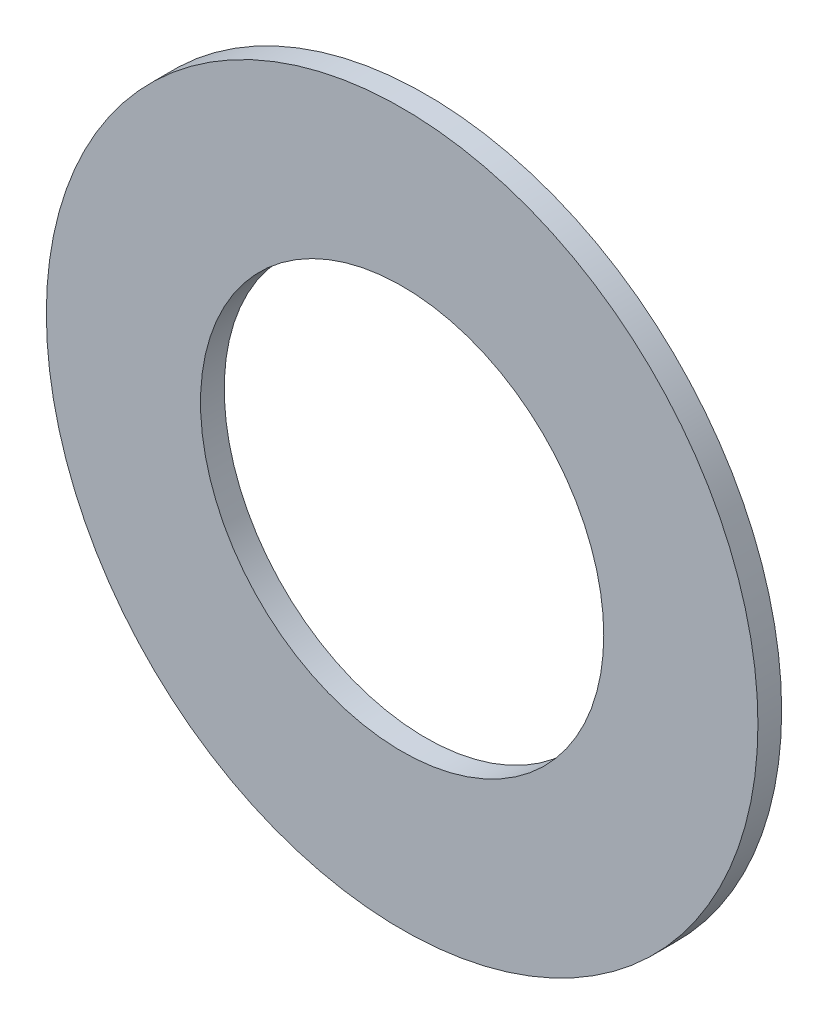
ISO-10303-21;
HEADER;
FILE_DESCRIPTION(('STEP AP214'),'2;1');
FILE_NAME('part.step','',(''),(''),'','','');
FILE_SCHEMA(('AUTOMOTIVE_DESIGN { 1 0 10303 214 1 1 1 1 }'));
ENDSEC;
DATA;
#1=APPLICATION_CONTEXT('core data for automotive mechanical design processes');
#2=APPLICATION_PROTOCOL_DEFINITION('international standard','automotive_design',2000,#1);
#3=PRODUCT_CONTEXT('',#1,'mechanical');
#4=PRODUCT('Part','Part','',(#3));
#5=PRODUCT_RELATED_PRODUCT_CATEGORY('part','',(#4));
#6=PRODUCT_DEFINITION_FORMATION('','',#4);
#7=PRODUCT_DEFINITION_CONTEXT('part definition',#1,'design');
#8=PRODUCT_DEFINITION('design','',#6,#7);
#9=PRODUCT_DEFINITION_SHAPE('','',#8);
#10=(LENGTH_UNIT() NAMED_UNIT(*) SI_UNIT(.MILLI.,.METRE.));
#11=(NAMED_UNIT(*) PLANE_ANGLE_UNIT() SI_UNIT($,.RADIAN.));
#12=(NAMED_UNIT(*) SI_UNIT($,.STERADIAN.) SOLID_ANGLE_UNIT());
#13=UNCERTAINTY_MEASURE_WITH_UNIT(LENGTH_MEASURE(1.E-05),#10,'distance_accuracy_value','');
#14=(GEOMETRIC_REPRESENTATION_CONTEXT(3) GLOBAL_UNCERTAINTY_ASSIGNED_CONTEXT((#13)) GLOBAL_UNIT_ASSIGNED_CONTEXT((#10,
#11,#12)) REPRESENTATION_CONTEXT('',''));
#15=CARTESIAN_POINT('',(0.,0.,0.));
#16=DIRECTION('',(0.,0.,1.));
#17=DIRECTION('',(1.,0.,0.));
#18=AXIS2_PLACEMENT_3D('',#15,#16,#17);
#19=CARTESIAN_POINT('',(0.,0.,1.));
#20=DIRECTION('',(0.,0.,1.));
#21=DIRECTION('',(1.,0.,0.));
#22=AXIS2_PLACEMENT_3D('',#19,#20,#21);
#23=PLANE('',#22);
#24=CARTESIAN_POINT('',(0.,0.,1.));
#25=DIRECTION('',(0.,0.,1.));
#26=DIRECTION('',(1.,0.,0.));
#27=AXIS2_PLACEMENT_3D('',#24,#25,#26);
#28=CIRCLE('',#27,15.);
#29=CARTESIAN_POINT('',(15.,0.,1.));
#30=VERTEX_POINT('',#29);
#31=EDGE_CURVE('E10',#30,#30,#28,.T.);
#32=ORIENTED_EDGE('',*,*,#31,.T.);
#33=EDGE_LOOP('',(#32));
#34=FACE_BOUND('',#33,.T.);
#35=CARTESIAN_POINT('',(0.,0.,1.));
#36=DIRECTION('',(0.,0.,1.));
#37=DIRECTION('',(1.,0.,0.));
#38=AXIS2_PLACEMENT_3D('',#35,#36,#37);
#39=CIRCLE('',#38,8.5);
#40=CARTESIAN_POINT('',(8.5,0.,1.));
#41=VERTEX_POINT('',#40);
#42=EDGE_CURVE('E48',#41,#41,#39,.T.);
#43=ORIENTED_EDGE('',*,*,#42,.F.);
#44=EDGE_LOOP('',(#43));
#45=FACE_BOUND('',#44,.T.);
#46=ADVANCED_FACE('F37',(#34,#45),#23,.T.);
#47=CARTESIAN_POINT('',(0.,0.,0.));
#48=DIRECTION('',(0.,0.,1.));
#49=DIRECTION('',(1.,0.,0.));
#50=AXIS2_PLACEMENT_3D('',#47,#48,#49);
#51=PLANE('',#50);
#52=CARTESIAN_POINT('',(0.,0.,0.));
#53=DIRECTION('',(0.,0.,1.));
#54=DIRECTION('',(1.,0.,0.));
#55=AXIS2_PLACEMENT_3D('',#52,#53,#54);
#56=CIRCLE('',#55,15.);
#57=CARTESIAN_POINT('',(15.,0.,0.));
#58=VERTEX_POINT('',#57);
#59=EDGE_CURVE('E41',#58,#58,#56,.T.);
#60=ORIENTED_EDGE('',*,*,#59,.F.);
#61=EDGE_LOOP('',(#60));
#62=FACE_BOUND('',#61,.T.);
#63=CARTESIAN_POINT('',(0.,0.,0.));
#64=DIRECTION('',(0.,0.,1.));
#65=DIRECTION('',(1.,0.,0.));
#66=AXIS2_PLACEMENT_3D('',#63,#64,#65);
#67=CIRCLE('',#66,8.5);
#68=CARTESIAN_POINT('',(8.5,0.,0.));
#69=VERTEX_POINT('',#68);
#70=EDGE_CURVE('E50',#69,#69,#67,.T.);
#71=ORIENTED_EDGE('',*,*,#70,.T.);
#72=EDGE_LOOP('',(#71));
#73=FACE_BOUND('',#72,.T.);
#74=ADVANCED_FACE('F60',(#62,#73),#51,.F.);
#75=CARTESIAN_POINT('',(0.,0.,1.));
#76=DIRECTION('',(0.,0.,-1.));
#77=DIRECTION('',(-1.,0.,0.));
#78=AXIS2_PLACEMENT_3D('',#75,#76,#77);
#79=CYLINDRICAL_SURFACE('',#78,15.);
#80=ORIENTED_EDGE('',*,*,#31,.F.);
#81=EDGE_LOOP('',(#80));
#82=FACE_BOUND('',#81,.T.);
#83=ORIENTED_EDGE('',*,*,#59,.T.);
#84=EDGE_LOOP('',(#83));
#85=FACE_BOUND('',#84,.T.);
#86=ADVANCED_FACE('F39',(#82,#85),#79,.T.);
#87=CARTESIAN_POINT('',(0.,0.,1.));
#88=DIRECTION('',(0.,0.,-1.));
#89=DIRECTION('',(-1.,0.,0.));
#90=AXIS2_PLACEMENT_3D('',#87,#88,#89);
#91=CYLINDRICAL_SURFACE('',#90,8.5);
#92=ORIENTED_EDGE('',*,*,#42,.T.);
#93=EDGE_LOOP('',(#92));
#94=FACE_BOUND('',#93,.T.);
#95=ORIENTED_EDGE('',*,*,#70,.F.);
#96=EDGE_LOOP('',(#95));
#97=FACE_BOUND('',#96,.T.);
#98=ADVANCED_FACE('F56',(#94,#97),#91,.F.);
#99=CLOSED_SHELL('',(#46,#74,#86,#98));
#100=MANIFOLD_SOLID_BREP('B2',#99);
#101=ADVANCED_BREP_SHAPE_REPRESENTATION('',(#18,#100),#14);
#102=SHAPE_DEFINITION_REPRESENTATION(#9,#101);
ENDSEC;
END-ISO-10303-21;
